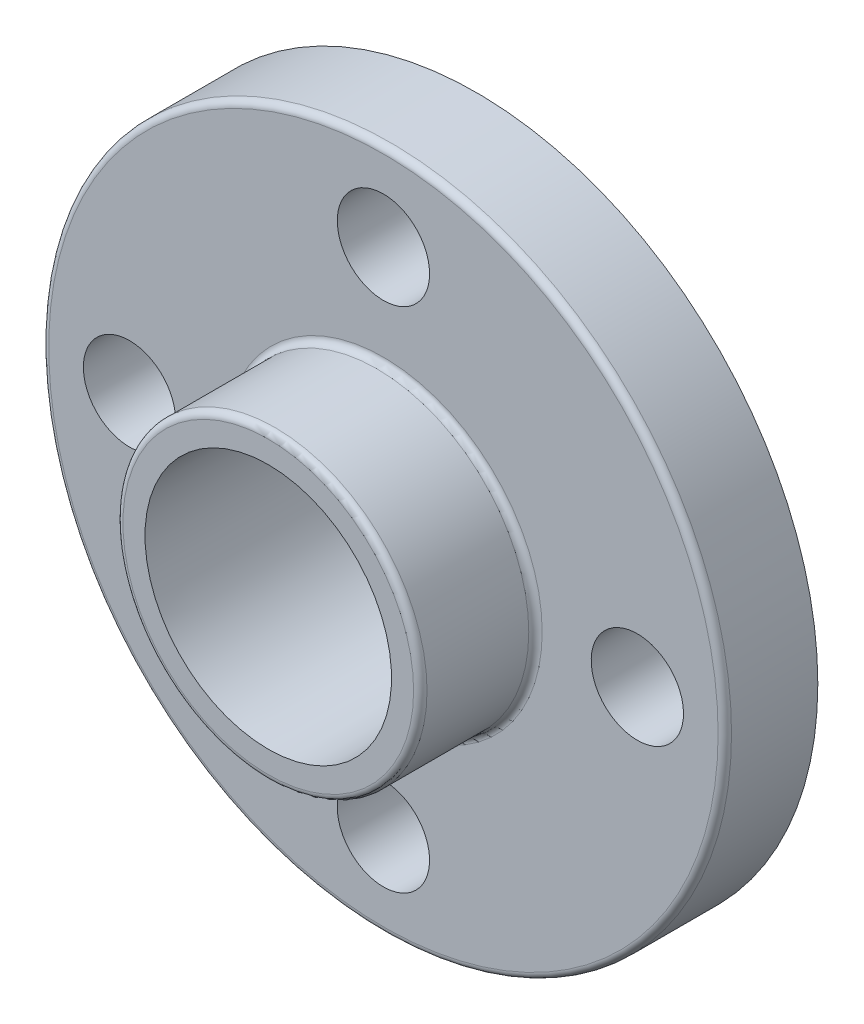
ISO-10303-21;
HEADER;
FILE_DESCRIPTION(('STEP AP214'),'2;1');
FILE_NAME('part.step','',(''),(''),'','','');
FILE_SCHEMA(('AUTOMOTIVE_DESIGN { 1 0 10303 214 1 1 1 1 }'));
ENDSEC;
DATA;
#1=APPLICATION_CONTEXT('core data for automotive mechanical design processes');
#2=APPLICATION_PROTOCOL_DEFINITION('international standard','automotive_design',2000,#1);
#3=PRODUCT_CONTEXT('',#1,'mechanical');
#4=PRODUCT('Part','Part','',(#3));
#5=PRODUCT_RELATED_PRODUCT_CATEGORY('part','',(#4));
#6=PRODUCT_DEFINITION_FORMATION('','',#4);
#7=PRODUCT_DEFINITION_CONTEXT('part definition',#1,'design');
#8=PRODUCT_DEFINITION('design','',#6,#7);
#9=PRODUCT_DEFINITION_SHAPE('','',#8);
#10=(LENGTH_UNIT() NAMED_UNIT(*) SI_UNIT(.MILLI.,.METRE.));
#11=(NAMED_UNIT(*) PLANE_ANGLE_UNIT() SI_UNIT($,.RADIAN.));
#12=(NAMED_UNIT(*) SI_UNIT($,.STERADIAN.) SOLID_ANGLE_UNIT());
#13=UNCERTAINTY_MEASURE_WITH_UNIT(LENGTH_MEASURE(1.E-05),#10,'distance_accuracy_value','');
#14=(GEOMETRIC_REPRESENTATION_CONTEXT(3) GLOBAL_UNCERTAINTY_ASSIGNED_CONTEXT((#13)) GLOBAL_UNIT_ASSIGNED_CONTEXT((#10,
#11,#12)) REPRESENTATION_CONTEXT('',''));
#15=CARTESIAN_POINT('',(0.,0.,0.));
#16=DIRECTION('',(0.,0.,1.));
#17=DIRECTION('',(1.,0.,0.));
#18=AXIS2_PLACEMENT_3D('',#15,#16,#17);
#19=CARTESIAN_POINT('',(0.,0.,16.002));
#20=DIRECTION('',(0.,0.,1.));
#21=DIRECTION('',(1.,0.,0.));
#22=AXIS2_PLACEMENT_3D('',#19,#20,#21);
#23=PLANE('',#22);
#24=CARTESIAN_POINT('',(0.,0.,16.002));
#25=DIRECTION('',(0.,0.,1.));
#26=DIRECTION('',(1.,0.,0.));
#27=AXIS2_PLACEMENT_3D('',#24,#25,#26);
#28=CIRCLE('',#27,27.3165454545455);
#29=CARTESIAN_POINT('',(27.3165454545455,0.,16.002));
#30=VERTEX_POINT('',#29);
#31=EDGE_CURVE('E44',#30,#30,#28,.F.);
#32=ORIENTED_EDGE('',*,*,#31,.T.);
#33=EDGE_LOOP('',(#32));
#34=FACE_BOUND('',#33,.T.);
#35=CARTESIAN_POINT('',(0.,0.,16.002));
#36=DIRECTION('',(0.,0.,1.));
#37=DIRECTION('',(1.,0.,0.));
#38=AXIS2_PLACEMENT_3D('',#35,#36,#37);
#39=CIRCLE('',#38,57.5829545454545);
#40=CARTESIAN_POINT('',(57.5829545454545,0.,16.002));
#41=VERTEX_POINT('',#40);
#42=EDGE_CURVE('E51',#41,#41,#39,.T.);
#43=ORIENTED_EDGE('',*,*,#42,.T.);
#44=EDGE_LOOP('',(#43));
#45=FACE_BOUND('',#44,.T.);
#46=CARTESIAN_POINT('',(43.688,4.57607510194136E-13,16.002));
#47=DIRECTION('',(0.,0.,1.));
#48=DIRECTION('',(0.,-1.,0.));
#49=AXIS2_PLACEMENT_3D('',#46,#47,#48);
#50=CIRCLE('',#49,7.9375);
#51=CARTESIAN_POINT('',(43.6880000000001,-7.93749999999954,16.002));
#52=VERTEX_POINT('',#51);
#53=EDGE_CURVE('E97',#52,#52,#50,.T.);
#54=ORIENTED_EDGE('',*,*,#53,.F.);
#55=EDGE_LOOP('',(#54));
#56=FACE_BOUND('',#55,.T.);
#57=CARTESIAN_POINT('',(3.05071673462758E-13,-43.688,16.002));
#58=DIRECTION('',(0.,0.,1.));
#59=DIRECTION('',(-1.,0.,0.));
#60=AXIS2_PLACEMENT_3D('',#57,#58,#59);
#61=CIRCLE('',#60,7.9375);
#62=CARTESIAN_POINT('',(-7.93749999999969,-43.6880000000001,16.002));
#63=VERTEX_POINT('',#62);
#64=EDGE_CURVE('E90',#63,#63,#61,.T.);
#65=ORIENTED_EDGE('',*,*,#64,.F.);
#66=EDGE_LOOP('',(#65));
#67=FACE_BOUND('',#66,.T.);
#68=CARTESIAN_POINT('',(-43.688,-1.52535836731379E-13,16.002));
#69=DIRECTION('',(0.,0.,1.));
#70=DIRECTION('',(0.,1.,0.));
#71=AXIS2_PLACEMENT_3D('',#68,#69,#70);
#72=CIRCLE('',#71,7.9375);
#73=CARTESIAN_POINT('',(-43.688,7.93749999999985,16.002));
#74=VERTEX_POINT('',#73);
#75=EDGE_CURVE('E83',#74,#74,#72,.T.);
#76=ORIENTED_EDGE('',*,*,#75,.F.);
#77=EDGE_LOOP('',(#76));
#78=FACE_BOUND('',#77,.T.);
#79=CARTESIAN_POINT('',(0.,43.688,16.002));
#80=DIRECTION('',(0.,0.,1.));
#81=DIRECTION('',(1.,0.,0.));
#82=AXIS2_PLACEMENT_3D('',#79,#80,#81);
#83=CIRCLE('',#82,7.9375);
#84=CARTESIAN_POINT('',(7.9375,43.688,16.002));
#85=VERTEX_POINT('',#84);
#86=EDGE_CURVE('E76',#85,#85,#83,.T.);
#87=ORIENTED_EDGE('',*,*,#86,.F.);
#88=EDGE_LOOP('',(#87));
#89=FACE_BOUND('',#88,.T.);
#90=ADVANCED_FACE('F36',(#34,#45,#56,#67,#78,#89),#23,.T.);
#91=CARTESIAN_POINT('',(0.,0.,16.002));
#92=DIRECTION('',(0.,0.,-1.));
#93=DIRECTION('',(-1.,0.,0.));
#94=AXIS2_PLACEMENT_3D('',#91,#92,#93);
#95=CYLINDRICAL_SURFACE('',#94,58.7375);
#96=CARTESIAN_POINT('',(0.,0.,14.8474545454545));
#97=DIRECTION('',(0.,0.,1.));
#98=DIRECTION('',(1.,0.,0.));
#99=AXIS2_PLACEMENT_3D('',#96,#97,#98);
#100=CIRCLE('',#99,58.7375);
#101=CARTESIAN_POINT('',(58.7375,0.,14.8474545454545));
#102=VERTEX_POINT('',#101);
#103=EDGE_CURVE('E10',#102,#102,#100,.F.);
#104=ORIENTED_EDGE('',*,*,#103,.T.);
#105=EDGE_LOOP('',(#104));
#106=FACE_BOUND('',#105,.T.);
#107=CARTESIAN_POINT('',(0.,0.,0.));
#108=DIRECTION('',(0.,0.,1.));
#109=DIRECTION('',(1.,0.,0.));
#110=AXIS2_PLACEMENT_3D('',#107,#108,#109);
#111=CIRCLE('',#110,58.7375);
#112=CARTESIAN_POINT('',(58.7375,0.,0.));
#113=VERTEX_POINT('',#112);
#114=EDGE_CURVE('E71',#113,#113,#111,.T.);
#115=ORIENTED_EDGE('',*,*,#114,.T.);
#116=EDGE_LOOP('',(#115));
#117=FACE_BOUND('',#116,.T.);
#118=ADVANCED_FACE('F127',(#106,#117),#95,.T.);
#119=CARTESIAN_POINT('',(0.,0.,0.));
#120=DIRECTION('',(0.,0.,1.));
#121=DIRECTION('',(1.,0.,0.));
#122=AXIS2_PLACEMENT_3D('',#119,#120,#121);
#123=PLANE('',#122);
#124=CARTESIAN_POINT('',(0.,0.,0.));
#125=DIRECTION('',(0.,0.,-1.));
#126=DIRECTION('',(0.,1.,0.));
#127=AXIS2_PLACEMENT_3D('',#124,#125,#126);
#128=CIRCLE('',#127,16.2306);
#129=CARTESIAN_POINT('',(0.,16.2306,0.));
#130=VERTEX_POINT('',#129);
#131=EDGE_CURVE('E116',#130,#130,#128,.T.);
#132=ORIENTED_EDGE('',*,*,#131,.F.);
#133=EDGE_LOOP('',(#132));
#134=FACE_BOUND('',#133,.T.);
#135=CARTESIAN_POINT('',(43.688,4.57607510194136E-13,0.));
#136=DIRECTION('',(0.,0.,1.));
#137=DIRECTION('',(0.,-1.,0.));
#138=AXIS2_PLACEMENT_3D('',#135,#136,#137);
#139=CIRCLE('',#138,7.9375);
#140=CARTESIAN_POINT('',(43.6880000000001,-7.93749999999954,0.));
#141=VERTEX_POINT('',#140);
#142=EDGE_CURVE('E94',#141,#141,#139,.T.);
#143=ORIENTED_EDGE('',*,*,#142,.T.);
#144=EDGE_LOOP('',(#143));
#145=FACE_BOUND('',#144,.T.);
#146=CARTESIAN_POINT('',(3.05071673462758E-13,-43.688,0.));
#147=DIRECTION('',(0.,0.,1.));
#148=DIRECTION('',(-1.,0.,0.));
#149=AXIS2_PLACEMENT_3D('',#146,#147,#148);
#150=CIRCLE('',#149,7.9375);
#151=CARTESIAN_POINT('',(-7.93749999999969,-43.6880000000001,0.));
#152=VERTEX_POINT('',#151);
#153=EDGE_CURVE('E87',#152,#152,#150,.T.);
#154=ORIENTED_EDGE('',*,*,#153,.T.);
#155=EDGE_LOOP('',(#154));
#156=FACE_BOUND('',#155,.T.);
#157=CARTESIAN_POINT('',(-43.688,-1.52535836731379E-13,0.));
#158=DIRECTION('',(0.,0.,1.));
#159=DIRECTION('',(0.,1.,0.));
#160=AXIS2_PLACEMENT_3D('',#157,#158,#159);
#161=CIRCLE('',#160,7.9375);
#162=CARTESIAN_POINT('',(-43.688,7.93749999999985,0.));
#163=VERTEX_POINT('',#162);
#164=EDGE_CURVE('E80',#163,#163,#161,.T.);
#165=ORIENTED_EDGE('',*,*,#164,.T.);
#166=EDGE_LOOP('',(#165));
#167=FACE_BOUND('',#166,.T.);
#168=CARTESIAN_POINT('',(0.,43.688,0.));
#169=DIRECTION('',(0.,0.,1.));
#170=DIRECTION('',(1.,0.,0.));
#171=AXIS2_PLACEMENT_3D('',#168,#169,#170);
#172=CIRCLE('',#171,7.9375);
#173=CARTESIAN_POINT('',(7.9375,43.688,0.));
#174=VERTEX_POINT('',#173);
#175=EDGE_CURVE('E75',#174,#174,#172,.T.);
#176=ORIENTED_EDGE('',*,*,#175,.T.);
#177=EDGE_LOOP('',(#176));
#178=FACE_BOUND('',#177,.T.);
#179=ORIENTED_EDGE('',*,*,#114,.F.);
#180=EDGE_LOOP('',(#179));
#181=FACE_BOUND('',#180,.T.);
#182=ADVANCED_FACE('F123',(#134,#145,#156,#167,#178,#181),#123,.F.);
#183=CARTESIAN_POINT('',(0.,0.,35.814));
#184=DIRECTION('',(0.,0.,-1.));
#185=DIRECTION('',(-1.,0.,0.));
#186=AXIS2_PLACEMENT_3D('',#183,#184,#185);
#187=CYLINDRICAL_SURFACE('',#186,26.162);
#188=CARTESIAN_POINT('',(0.,0.,34.6594545454545));
#189=DIRECTION('',(0.,0.,1.));
#190=DIRECTION('',(1.,0.,0.));
#191=AXIS2_PLACEMENT_3D('',#188,#189,#190);
#192=CIRCLE('',#191,26.162);
#193=CARTESIAN_POINT('',(26.162,0.,34.6594545454545));
#194=VERTEX_POINT('',#193);
#195=EDGE_CURVE('E57',#194,#194,#192,.F.);
#196=ORIENTED_EDGE('',*,*,#195,.T.);
#197=EDGE_LOOP('',(#196));
#198=FACE_BOUND('',#197,.T.);
#199=CARTESIAN_POINT('',(0.,0.,17.1565454545455));
#200=DIRECTION('',(0.,0.,1.));
#201=DIRECTION('',(1.,0.,0.));
#202=AXIS2_PLACEMENT_3D('',#199,#200,#201);
#203=CIRCLE('',#202,26.162);
#204=CARTESIAN_POINT('',(26.162,0.,17.1565454545455));
#205=VERTEX_POINT('',#204);
#206=EDGE_CURVE('E63',#205,#205,#203,.T.);
#207=ORIENTED_EDGE('',*,*,#206,.T.);
#208=EDGE_LOOP('',(#207));
#209=FACE_BOUND('',#208,.T.);
#210=ADVANCED_FACE('F126',(#198,#209),#187,.T.);
#211=CARTESIAN_POINT('',(0.,0.,35.814));
#212=DIRECTION('',(0.,0.,1.));
#213=DIRECTION('',(1.,0.,0.));
#214=AXIS2_PLACEMENT_3D('',#211,#212,#213);
#215=PLANE('',#214);
#216=CARTESIAN_POINT('',(0.,0.,35.814));
#217=DIRECTION('',(0.,0.,-1.));
#218=DIRECTION('',(0.,1.,0.));
#219=AXIS2_PLACEMENT_3D('',#216,#217,#218);
#220=CIRCLE('',#219,21.209);
#221=CARTESIAN_POINT('',(0.,21.209,35.814));
#222=VERTEX_POINT('',#221);
#223=EDGE_CURVE('E101',#222,#222,#220,.T.);
#224=ORIENTED_EDGE('',*,*,#223,.T.);
#225=EDGE_LOOP('',(#224));
#226=FACE_BOUND('',#225,.T.);
#227=CARTESIAN_POINT('',(0.,0.,35.814));
#228=DIRECTION('',(0.,0.,1.));
#229=DIRECTION('',(1.,0.,0.));
#230=AXIS2_PLACEMENT_3D('',#227,#228,#229);
#231=CIRCLE('',#230,25.0074545454546);
#232=CARTESIAN_POINT('',(25.0074545454546,0.,35.814));
#233=VERTEX_POINT('',#232);
#234=EDGE_CURVE('E67',#233,#233,#231,.T.);
#235=ORIENTED_EDGE('',*,*,#234,.T.);
#236=EDGE_LOOP('',(#235));
#237=FACE_BOUND('',#236,.T.);
#238=ADVANCED_FACE('F162',(#226,#237),#215,.T.);
#239=CARTESIAN_POINT('',(0.,43.688,0.));
#240=DIRECTION('',(0.,0.,1.));
#241=DIRECTION('',(1.,0.,0.));
#242=AXIS2_PLACEMENT_3D('',#239,#240,#241);
#243=CYLINDRICAL_SURFACE('',#242,7.9375);
#244=ORIENTED_EDGE('',*,*,#175,.F.);
#245=EDGE_LOOP('',(#244));
#246=FACE_BOUND('',#245,.T.);
#247=ORIENTED_EDGE('',*,*,#86,.T.);
#248=EDGE_LOOP('',(#247));
#249=FACE_BOUND('',#248,.T.);
#250=ADVANCED_FACE('F168',(#246,#249),#243,.F.);
#251=CARTESIAN_POINT('',(-43.688,-1.52535836731379E-13,0.));
#252=DIRECTION('',(0.,0.,1.));
#253=DIRECTION('',(1.,0.,0.));
#254=AXIS2_PLACEMENT_3D('',#251,#252,#253);
#255=CYLINDRICAL_SURFACE('',#254,7.9375);
#256=ORIENTED_EDGE('',*,*,#164,.F.);
#257=EDGE_LOOP('',(#256));
#258=FACE_BOUND('',#257,.T.);
#259=ORIENTED_EDGE('',*,*,#75,.T.);
#260=EDGE_LOOP('',(#259));
#261=FACE_BOUND('',#260,.T.);
#262=ADVANCED_FACE('F174',(#258,#261),#255,.F.);
#263=CARTESIAN_POINT('',(3.05071673462758E-13,-43.688,0.));
#264=DIRECTION('',(0.,0.,1.));
#265=DIRECTION('',(1.,0.,0.));
#266=AXIS2_PLACEMENT_3D('',#263,#264,#265);
#267=CYLINDRICAL_SURFACE('',#266,7.9375);
#268=ORIENTED_EDGE('',*,*,#153,.F.);
#269=EDGE_LOOP('',(#268));
#270=FACE_BOUND('',#269,.T.);
#271=ORIENTED_EDGE('',*,*,#64,.T.);
#272=EDGE_LOOP('',(#271));
#273=FACE_BOUND('',#272,.T.);
#274=ADVANCED_FACE('F178',(#270,#273),#267,.F.);
#275=CARTESIAN_POINT('',(43.688,4.57607510194136E-13,0.));
#276=DIRECTION('',(0.,0.,1.));
#277=DIRECTION('',(1.,0.,0.));
#278=AXIS2_PLACEMENT_3D('',#275,#276,#277);
#279=CYLINDRICAL_SURFACE('',#278,7.9375);
#280=ORIENTED_EDGE('',*,*,#142,.F.);
#281=EDGE_LOOP('',(#280));
#282=FACE_BOUND('',#281,.T.);
#283=ORIENTED_EDGE('',*,*,#53,.T.);
#284=EDGE_LOOP('',(#283));
#285=FACE_BOUND('',#284,.T.);
#286=ADVANCED_FACE('F149',(#282,#285),#279,.F.);
#287=CARTESIAN_POINT('',(0.,0.,34.6594545454545));
#288=DIRECTION('',(0.,0.,1.));
#289=DIRECTION('',(1.,0.,0.));
#290=AXIS2_PLACEMENT_3D('',#287,#288,#289);
#291=TOROIDAL_SURFACE('',#290,25.0074545454546,1.15454545454545);
#292=ORIENTED_EDGE('',*,*,#195,.F.);
#293=EDGE_LOOP('',(#292));
#294=FACE_BOUND('',#293,.T.);
#295=ORIENTED_EDGE('',*,*,#234,.F.);
#296=EDGE_LOOP('',(#295));
#297=FACE_BOUND('',#296,.T.);
#298=ADVANCED_FACE('F146',(#294,#297),#291,.T.);
#299=CARTESIAN_POINT('',(0.,0.,17.1565454545455));
#300=DIRECTION('',(0.,0.,1.));
#301=DIRECTION('',(1.,0.,0.));
#302=AXIS2_PLACEMENT_3D('',#299,#300,#301);
#303=TOROIDAL_SURFACE('',#302,27.3165454545455,1.15454545454545);
#304=ORIENTED_EDGE('',*,*,#31,.F.);
#305=EDGE_LOOP('',(#304));
#306=FACE_BOUND('',#305,.T.);
#307=ORIENTED_EDGE('',*,*,#206,.F.);
#308=EDGE_LOOP('',(#307));
#309=FACE_BOUND('',#308,.T.);
#310=ADVANCED_FACE('F148',(#306,#309),#303,.F.);
#311=CARTESIAN_POINT('',(0.,0.,14.8474545454545));
#312=DIRECTION('',(0.,0.,1.));
#313=DIRECTION('',(1.,0.,0.));
#314=AXIS2_PLACEMENT_3D('',#311,#312,#313);
#315=TOROIDAL_SURFACE('',#314,57.5829545454545,1.15454545454545);
#316=ORIENTED_EDGE('',*,*,#103,.F.);
#317=EDGE_LOOP('',(#316));
#318=FACE_BOUND('',#317,.T.);
#319=ORIENTED_EDGE('',*,*,#42,.F.);
#320=EDGE_LOOP('',(#319));
#321=FACE_BOUND('',#320,.T.);
#322=ADVANCED_FACE('F38',(#318,#321),#315,.T.);
#323=CARTESIAN_POINT('',(0.,0.,4.31799999999999));
#324=DIRECTION('',(0.,0.,1.));
#325=DIRECTION('',(0.,-1.,0.));
#326=AXIS2_PLACEMENT_3D('',#323,#324,#325);
#327=CONICAL_SURFACE('',#326,21.0185,0.00604831334237196);
#328=ORIENTED_EDGE('',*,*,#223,.F.);
#329=EDGE_LOOP('',(#328));
#330=FACE_BOUND('',#329,.T.);
#331=CARTESIAN_POINT('',(0.,0.,4.31799999999999));
#332=DIRECTION('',(0.,0.,-1.));
#333=DIRECTION('',(0.,1.,0.));
#334=AXIS2_PLACEMENT_3D('',#331,#332,#333);
#335=CIRCLE('',#334,21.0185);
#336=CARTESIAN_POINT('',(0.,21.0185,4.31799999999999));
#337=VERTEX_POINT('',#336);
#338=EDGE_CURVE('E108',#337,#337,#335,.T.);
#339=ORIENTED_EDGE('',*,*,#338,.T.);
#340=EDGE_LOOP('',(#339));
#341=FACE_BOUND('',#340,.T.);
#342=ADVANCED_FACE('F156',(#330,#341),#327,.F.);
#343=CARTESIAN_POINT('',(0.,21.0185,4.318));
#344=DIRECTION('',(0.,0.,-1.));
#345=DIRECTION('',(0.,1.,0.));
#346=AXIS2_PLACEMENT_3D('',#343,#344,#345);
#347=PLANE('',#346);
#348=ORIENTED_EDGE('',*,*,#338,.F.);
#349=EDGE_LOOP('',(#348));
#350=FACE_BOUND('',#349,.T.);
#351=CARTESIAN_POINT('',(0.,0.,4.318));
#352=DIRECTION('',(0.,0.,-1.));
#353=DIRECTION('',(0.,1.,0.));
#354=AXIS2_PLACEMENT_3D('',#351,#352,#353);
#355=CIRCLE('',#354,16.2306);
#356=CARTESIAN_POINT('',(0.,16.2306,4.318));
#357=VERTEX_POINT('',#356);
#358=EDGE_CURVE('E112',#357,#357,#355,.T.);
#359=ORIENTED_EDGE('',*,*,#358,.T.);
#360=EDGE_LOOP('',(#359));
#361=FACE_BOUND('',#360,.T.);
#362=ADVANCED_FACE('F188',(#350,#361),#347,.F.);
#363=CARTESIAN_POINT('',(0.,0.,0.));
#364=DIRECTION('',(0.,0.,-1.));
#365=DIRECTION('',(0.,1.,0.));
#366=AXIS2_PLACEMENT_3D('',#363,#364,#365);
#367=CYLINDRICAL_SURFACE('',#366,16.2306);
#368=ORIENTED_EDGE('',*,*,#358,.F.);
#369=EDGE_LOOP('',(#368));
#370=FACE_BOUND('',#369,.T.);
#371=ORIENTED_EDGE('',*,*,#131,.T.);
#372=EDGE_LOOP('',(#371));
#373=FACE_BOUND('',#372,.T.);
#374=ADVANCED_FACE('F121',(#370,#373),#367,.F.);
#375=CLOSED_SHELL('',(#90,#118,#182,#210,#238,#250,#262,#274,#286,#298,#310,#322,#342,#362,#374));
#376=MANIFOLD_SOLID_BREP('B2',#375);
#377=ADVANCED_BREP_SHAPE_REPRESENTATION('',(#18,#376),#14);
#378=SHAPE_DEFINITION_REPRESENTATION(#9,#377);
ENDSEC;
END-ISO-10303-21;
